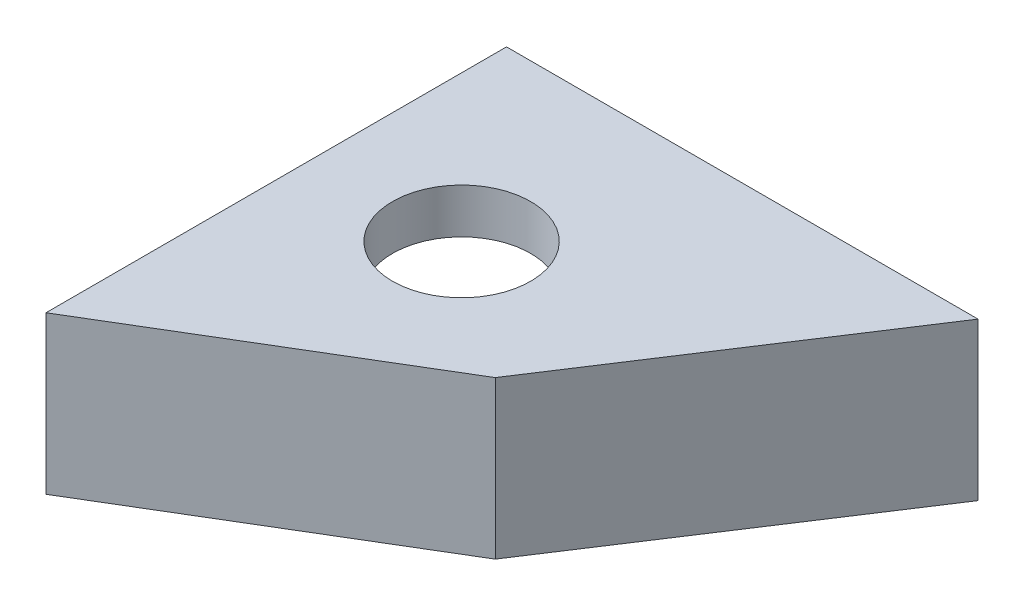
ISO-10303-21;
HEADER;
FILE_DESCRIPTION(('STEP AP214'),'2;1');
FILE_NAME('part.step','',(''),(''),'','','');
FILE_SCHEMA(('AUTOMOTIVE_DESIGN { 1 0 10303 214 1 1 1 1 }'));
ENDSEC;
DATA;
#1=APPLICATION_CONTEXT('core data for automotive mechanical design processes');
#2=APPLICATION_PROTOCOL_DEFINITION('international standard','automotive_design',2000,#1);
#3=PRODUCT_CONTEXT('',#1,'mechanical');
#4=PRODUCT('Part','Part','',(#3));
#5=PRODUCT_RELATED_PRODUCT_CATEGORY('part','',(#4));
#6=PRODUCT_DEFINITION_FORMATION('','',#4);
#7=PRODUCT_DEFINITION_CONTEXT('part definition',#1,'design');
#8=PRODUCT_DEFINITION('design','',#6,#7);
#9=PRODUCT_DEFINITION_SHAPE('','',#8);
#10=(LENGTH_UNIT() NAMED_UNIT(*) SI_UNIT(.MILLI.,.METRE.));
#11=(NAMED_UNIT(*) PLANE_ANGLE_UNIT() SI_UNIT($,.RADIAN.));
#12=(NAMED_UNIT(*) SI_UNIT($,.STERADIAN.) SOLID_ANGLE_UNIT());
#13=UNCERTAINTY_MEASURE_WITH_UNIT(LENGTH_MEASURE(1.E-05),#10,'distance_accuracy_value','');
#14=(GEOMETRIC_REPRESENTATION_CONTEXT(3) GLOBAL_UNCERTAINTY_ASSIGNED_CONTEXT((#13)) GLOBAL_UNIT_ASSIGNED_CONTEXT((#10,
#11,#12)) REPRESENTATION_CONTEXT('',''));
#15=CARTESIAN_POINT('',(0.,0.,0.));
#16=DIRECTION('',(0.,0.,1.));
#17=DIRECTION('',(1.,0.,0.));
#18=AXIS2_PLACEMENT_3D('',#15,#16,#17);
#19=CARTESIAN_POINT('',(0.,0.,0.));
#20=DIRECTION('',(0.,1.,0.));
#21=DIRECTION('',(0.,0.,1.));
#22=AXIS2_PLACEMENT_3D('',#19,#20,#21);
#23=PLANE('',#22);
#24=CARTESIAN_POINT('',(76.3822956151013,0.,129.15690287011));
#25=DIRECTION('',(0.,1.,0.));
#26=DIRECTION('',(0.,0.,1.));
#27=AXIS2_PLACEMENT_3D('',#24,#25,#26);
#28=CIRCLE('',#27,3.07499999999999);
#29=CARTESIAN_POINT('',(76.3822956151013,0.,132.23190287011));
#30=VERTEX_POINT('',#29);
#31=EDGE_CURVE('E125',#30,#30,#28,.T.);
#32=ORIENTED_EDGE('',*,*,#31,.T.);
#33=EDGE_LOOP('',(#32));
#34=FACE_BOUND('',#33,.T.);
#35=DIRECTION('',(0.687083957502849,0.,-0.726578031144779));
#36=VECTOR('',#35,1.);
#37=CARTESIAN_POINT('',(90.8714601720809,0.,120.65690287011));
#38=LINE('',#37,#36);
#39=CARTESIAN_POINT('',(80.3000063196038,0.,131.836011394761));
#40=VERTEX_POINT('',#39);
#41=CARTESIAN_POINT('',(90.8714601720809,0.,120.65690287011));
#42=VERTEX_POINT('',#41);
#43=EDGE_CURVE('E48',#40,#42,#38,.T.);
#44=ORIENTED_EDGE('',*,*,#43,.F.);
#45=DIRECTION('',(0.764931472959137,0.,-0.644111668638726));
#46=VECTOR('',#45,1.);
#47=CARTESIAN_POINT('',(80.3000063196038,0.,131.836011394761));
#48=LINE('',#47,#46);
#49=CARTESIAN_POINT('',(74.8425740517613,0.,136.43145023966));
#50=VERTEX_POINT('',#49);
#51=EDGE_CURVE('E52',#50,#40,#48,.T.);
#52=ORIENTED_EDGE('',*,*,#51,.F.);
#53=DIRECTION('',(0.857492925712545,0.,-0.514495755427526));
#54=VECTOR('',#53,1.);
#55=CARTESIAN_POINT('',(71.8822956151013,0.,138.207617301656));
#56=LINE('',#55,#54);
#57=CARTESIAN_POINT('',(71.8822956151013,0.,138.207617301656));
#58=VERTEX_POINT('',#57);
#59=EDGE_CURVE('E190',#58,#50,#56,.T.);
#60=ORIENTED_EDGE('',*,*,#59,.F.);
#61=DIRECTION('',(0.848134440962652,0.,-0.529781058601542));
#62=VECTOR('',#61,1.);
#63=CARTESIAN_POINT('',(71.8822956151013,0.,138.207617301656));
#64=LINE('',#63,#62);
#65=CARTESIAN_POINT('',(69.8822956151013,0.,139.45690287011));
#66=VERTEX_POINT('',#65);
#67=EDGE_CURVE('E191',#66,#58,#64,.T.);
#68=ORIENTED_EDGE('',*,*,#67,.F.);
#69=DIRECTION('',(0.,0.,1.));
#70=VECTOR('',#69,1.);
#71=CARTESIAN_POINT('',(69.8822956151013,0.,141.15690287011));
#72=LINE('',#71,#70);
#73=CARTESIAN_POINT('',(69.8822956151013,0.,120.65690287011));
#74=VERTEX_POINT('',#73);
#75=EDGE_CURVE('E124',#74,#66,#72,.T.);
#76=ORIENTED_EDGE('',*,*,#75,.F.);
#77=DIRECTION('',(-1.,0.,0.));
#78=VECTOR('',#77,1.);
#79=CARTESIAN_POINT('',(69.8822956151013,0.,120.65690287011));
#80=LINE('',#79,#78);
#81=EDGE_CURVE('E135',#42,#74,#80,.T.);
#82=ORIENTED_EDGE('',*,*,#81,.F.);
#83=EDGE_LOOP('',(#44,#52,#60,#68,#76,#82));
#84=FACE_BOUND('',#83,.T.);
#85=ADVANCED_FACE('F33',(#34,#84),#23,.F.);
#86=CARTESIAN_POINT('',(0.,2.,0.));
#87=DIRECTION('',(0.,1.,0.));
#88=DIRECTION('',(0.,0.,1.));
#89=AXIS2_PLACEMENT_3D('',#86,#87,#88);
#90=PLANE('',#89);
#91=DIRECTION('',(-1.,0.,0.));
#92=VECTOR('',#91,1.);
#93=CARTESIAN_POINT('',(69.8822956151013,2.,120.65690287011));
#94=LINE('',#93,#92);
#95=CARTESIAN_POINT('',(90.8714601720809,2.,120.65690287011));
#96=VERTEX_POINT('',#95);
#97=CARTESIAN_POINT('',(69.8822956151013,2.,120.65690287011));
#98=VERTEX_POINT('',#97);
#99=EDGE_CURVE('E137',#96,#98,#94,.T.);
#100=ORIENTED_EDGE('',*,*,#99,.T.);
#101=DIRECTION('',(0.,0.,1.));
#102=VECTOR('',#101,1.);
#103=CARTESIAN_POINT('',(69.8822956151013,2.,141.15690287011));
#104=LINE('',#103,#102);
#105=CARTESIAN_POINT('',(69.8822956151013,2.,141.15690287011));
#106=VERTEX_POINT('',#105);
#107=EDGE_CURVE('E140',#98,#106,#104,.T.);
#108=ORIENTED_EDGE('',*,*,#107,.T.);
#109=DIRECTION('',(0.857492925712545,0.,-0.514495755427525));
#110=VECTOR('',#109,1.);
#111=CARTESIAN_POINT('',(69.8822956151013,2.,141.15690287011));
#112=LINE('',#111,#110);
#113=CARTESIAN_POINT('',(82.3822956151013,2.,133.65690287011));
#114=VERTEX_POINT('',#113);
#115=EDGE_CURVE('E142',#106,#114,#112,.T.);
#116=ORIENTED_EDGE('',*,*,#115,.T.);
#117=DIRECTION('',(0.546760394266227,0.,-0.837289120472636));
#118=VECTOR('',#117,1.);
#119=CARTESIAN_POINT('',(90.8714601720809,2.,120.65690287011));
#120=LINE('',#119,#118);
#121=EDGE_CURVE('E144',#114,#96,#120,.T.);
#122=ORIENTED_EDGE('',*,*,#121,.T.);
#123=EDGE_LOOP('',(#100,#108,#116,#122));
#124=FACE_BOUND('',#123,.T.);
#125=CARTESIAN_POINT('',(76.3822956151013,2.,129.15690287011));
#126=DIRECTION('',(0.,1.,0.));
#127=DIRECTION('',(0.,0.,1.));
#128=AXIS2_PLACEMENT_3D('',#125,#126,#127);
#129=CIRCLE('',#128,3.07499999999999);
#130=CARTESIAN_POINT('',(76.3822956151013,2.,132.23190287011));
#131=VERTEX_POINT('',#130);
#132=EDGE_CURVE('E128',#131,#131,#129,.T.);
#133=ORIENTED_EDGE('',*,*,#132,.F.);
#134=EDGE_LOOP('',(#133));
#135=FACE_BOUND('',#134,.T.);
#136=ADVANCED_FACE('F159',(#124,#135),#90,.T.);
#137=CARTESIAN_POINT('',(69.8822956151013,2.,120.65690287011));
#138=DIRECTION('',(0.,0.,1.));
#139=DIRECTION('',(1.,0.,0.));
#140=AXIS2_PLACEMENT_3D('',#137,#138,#139);
#141=PLANE('',#140);
#142=ORIENTED_EDGE('',*,*,#81,.T.);
#143=DIRECTION('',(0.,-1.,0.));
#144=VECTOR('',#143,1.);
#145=CARTESIAN_POINT('',(69.8822956151013,2.,120.65690287011));
#146=LINE('',#145,#144);
#147=EDGE_CURVE('E11',#98,#74,#146,.T.);
#148=ORIENTED_EDGE('',*,*,#147,.F.);
#149=ORIENTED_EDGE('',*,*,#99,.F.);
#150=DIRECTION('',(0.,-1.,0.));
#151=VECTOR('',#150,1.);
#152=CARTESIAN_POINT('',(90.8714601720809,2.,120.65690287011));
#153=LINE('',#152,#151);
#154=EDGE_CURVE('E146',#96,#42,#153,.T.);
#155=ORIENTED_EDGE('',*,*,#154,.T.);
#156=EDGE_LOOP('',(#142,#148,#149,#155));
#157=FACE_BOUND('',#156,.T.);
#158=ADVANCED_FACE('F35',(#157),#141,.F.);
#159=CARTESIAN_POINT('',(69.8822956151013,2.,141.15690287011));
#160=DIRECTION('',(1.,0.,0.));
#161=DIRECTION('',(0.,0.,-1.));
#162=AXIS2_PLACEMENT_3D('',#159,#160,#161);
#163=PLANE('',#162);
#164=ORIENTED_EDGE('',*,*,#75,.T.);
#165=DIRECTION('',(0.,1.,0.));
#166=VECTOR('',#165,1.);
#167=CARTESIAN_POINT('',(69.8822956151013,-5.,139.45690287011));
#168=LINE('',#167,#166);
#169=CARTESIAN_POINT('',(69.8822956151013,-5.,139.45690287011));
#170=VERTEX_POINT('',#169);
#171=EDGE_CURVE('E105',#170,#66,#168,.T.);
#172=ORIENTED_EDGE('',*,*,#171,.F.);
#173=DIRECTION('',(0.,0.,-1.));
#174=VECTOR('',#173,1.);
#175=CARTESIAN_POINT('',(69.8822956151013,-5.,139.45690287011));
#176=LINE('',#175,#174);
#177=CARTESIAN_POINT('',(69.8822956151013,-5.,141.15690287011));
#178=VERTEX_POINT('',#177);
#179=EDGE_CURVE('E111',#178,#170,#176,.T.);
#180=ORIENTED_EDGE('',*,*,#179,.F.);
#181=DIRECTION('',(0.,-1.,0.));
#182=VECTOR('',#181,1.);
#183=CARTESIAN_POINT('',(69.8822956151013,2.,141.15690287011));
#184=LINE('',#183,#182);
#185=EDGE_CURVE('E41',#106,#178,#184,.T.);
#186=ORIENTED_EDGE('',*,*,#185,.F.);
#187=ORIENTED_EDGE('',*,*,#107,.F.);
#188=ORIENTED_EDGE('',*,*,#147,.T.);
#189=EDGE_LOOP('',(#164,#172,#180,#186,#187,#188));
#190=FACE_BOUND('',#189,.T.);
#191=ADVANCED_FACE('F123',(#190),#163,.F.);
#192=CARTESIAN_POINT('',(69.8822956151013,2.,141.15690287011));
#193=DIRECTION('',(-0.514495755427525,0.,-0.857492925712545));
#194=DIRECTION('',(-0.857492925712545,0.,0.514495755427525));
#195=AXIS2_PLACEMENT_3D('',#192,#193,#194);
#196=PLANE('',#195);
#197=ORIENTED_EDGE('',*,*,#185,.T.);
#198=DIRECTION('',(-0.857492925712545,0.,0.514495755427525));
#199=VECTOR('',#198,1.);
#200=CARTESIAN_POINT('',(69.8822956151013,-5.,141.15690287011));
#201=LINE('',#200,#199);
#202=CARTESIAN_POINT('',(82.3822956151013,-5.,133.65690287011));
#203=VERTEX_POINT('',#202);
#204=EDGE_CURVE('E118',#203,#178,#201,.T.);
#205=ORIENTED_EDGE('',*,*,#204,.F.);
#206=DIRECTION('',(0.,-1.,0.));
#207=VECTOR('',#206,1.);
#208=CARTESIAN_POINT('',(82.3822956151013,2.,133.65690287011));
#209=LINE('',#208,#207);
#210=EDGE_CURVE('E151',#114,#203,#209,.T.);
#211=ORIENTED_EDGE('',*,*,#210,.F.);
#212=ORIENTED_EDGE('',*,*,#115,.F.);
#213=EDGE_LOOP('',(#197,#205,#211,#212));
#214=FACE_BOUND('',#213,.T.);
#215=ADVANCED_FACE('F154',(#214),#196,.F.);
#216=CARTESIAN_POINT('',(90.8714601720809,2.,120.65690287011));
#217=DIRECTION('',(-0.837289120472636,0.,-0.546760394266227));
#218=DIRECTION('',(-0.546760394266227,0.,0.837289120472636));
#219=AXIS2_PLACEMENT_3D('',#216,#217,#218);
#220=PLANE('',#219);
#221=ORIENTED_EDGE('',*,*,#210,.T.);
#222=DIRECTION('',(-0.546760394266227,0.,0.837289120472636));
#223=VECTOR('',#222,1.);
#224=CARTESIAN_POINT('',(82.3822956151013,-5.,133.65690287011));
#225=LINE('',#224,#223);
#226=CARTESIAN_POINT('',(90.8714601720809,-5.,120.65690287011));
#227=VERTEX_POINT('',#226);
#228=EDGE_CURVE('E177',#227,#203,#225,.T.);
#229=ORIENTED_EDGE('',*,*,#228,.F.);
#230=DIRECTION('',(0.,1.,0.));
#231=VECTOR('',#230,1.);
#232=CARTESIAN_POINT('',(90.8714601720809,-5.,120.65690287011));
#233=LINE('',#232,#231);
#234=EDGE_CURVE('E170',#227,#42,#233,.T.);
#235=ORIENTED_EDGE('',*,*,#234,.T.);
#236=ORIENTED_EDGE('',*,*,#154,.F.);
#237=ORIENTED_EDGE('',*,*,#121,.F.);
#238=EDGE_LOOP('',(#221,#229,#235,#236,#237));
#239=FACE_BOUND('',#238,.T.);
#240=ADVANCED_FACE('F176',(#239),#220,.F.);
#241=CARTESIAN_POINT('',(76.3822956151013,2.,129.15690287011));
#242=DIRECTION('',(0.,-1.,0.));
#243=DIRECTION('',(0.,0.,-1.));
#244=AXIS2_PLACEMENT_3D('',#241,#242,#243);
#245=CYLINDRICAL_SURFACE('',#244,3.07499999999999);
#246=ORIENTED_EDGE('',*,*,#132,.T.);
#247=EDGE_LOOP('',(#246));
#248=FACE_BOUND('',#247,.T.);
#249=ORIENTED_EDGE('',*,*,#31,.F.);
#250=EDGE_LOOP('',(#249));
#251=FACE_BOUND('',#250,.T.);
#252=ADVANCED_FACE('F206',(#248,#251),#245,.F.);
#253=CARTESIAN_POINT('',(71.8822956151013,-5.,138.207617301656));
#254=DIRECTION('',(0.529781058601542,0.,0.848134440962652));
#255=DIRECTION('',(0.848134440962652,0.,-0.529781058601542));
#256=AXIS2_PLACEMENT_3D('',#253,#254,#255);
#257=PLANE('',#256);
#258=ORIENTED_EDGE('',*,*,#67,.T.);
#259=DIRECTION('',(0.,1.,0.));
#260=VECTOR('',#259,1.);
#261=CARTESIAN_POINT('',(71.8822956151013,-5.,138.207617301656));
#262=LINE('',#261,#260);
#263=CARTESIAN_POINT('',(71.8822956151013,-5.,138.207617301656));
#264=VERTEX_POINT('',#263);
#265=EDGE_CURVE('E107',#264,#58,#262,.T.);
#266=ORIENTED_EDGE('',*,*,#265,.F.);
#267=DIRECTION('',(0.848134440962652,0.,-0.529781058601542));
#268=VECTOR('',#267,1.);
#269=CARTESIAN_POINT('',(71.8822956151013,-5.,138.207617301656));
#270=LINE('',#269,#268);
#271=EDGE_CURVE('E100',#170,#264,#270,.T.);
#272=ORIENTED_EDGE('',*,*,#271,.F.);
#273=ORIENTED_EDGE('',*,*,#171,.T.);
#274=EDGE_LOOP('',(#258,#266,#272,#273));
#275=FACE_BOUND('',#274,.T.);
#276=ADVANCED_FACE('F103',(#275),#257,.F.);
#277=CARTESIAN_POINT('',(71.8822956151013,-5.,138.207617301656));
#278=DIRECTION('',(0.514495755427526,0.,0.857492925712545));
#279=DIRECTION('',(0.857492925712545,0.,-0.514495755427526));
#280=AXIS2_PLACEMENT_3D('',#277,#278,#279);
#281=PLANE('',#280);
#282=ORIENTED_EDGE('',*,*,#59,.T.);
#283=DIRECTION('',(0.,1.,0.));
#284=VECTOR('',#283,1.);
#285=CARTESIAN_POINT('',(74.8425740517613,-5.,136.43145023966));
#286=LINE('',#285,#284);
#287=CARTESIAN_POINT('',(74.8425740517613,-5.,136.43145023966));
#288=VERTEX_POINT('',#287);
#289=EDGE_CURVE('E130',#288,#50,#286,.T.);
#290=ORIENTED_EDGE('',*,*,#289,.F.);
#291=DIRECTION('',(0.857492925712545,0.,-0.514495755427526));
#292=VECTOR('',#291,1.);
#293=CARTESIAN_POINT('',(71.8822956151013,-5.,138.207617301656));
#294=LINE('',#293,#292);
#295=EDGE_CURVE('E110',#264,#288,#294,.T.);
#296=ORIENTED_EDGE('',*,*,#295,.F.);
#297=ORIENTED_EDGE('',*,*,#265,.T.);
#298=EDGE_LOOP('',(#282,#290,#296,#297));
#299=FACE_BOUND('',#298,.T.);
#300=ADVANCED_FACE('F189',(#299),#281,.F.);
#301=CARTESIAN_POINT('',(80.3000063196038,-5.,131.836011394761));
#302=DIRECTION('',(0.644111668638726,0.,0.764931472959137));
#303=DIRECTION('',(0.764931472959137,0.,-0.644111668638726));
#304=AXIS2_PLACEMENT_3D('',#301,#302,#303);
#305=PLANE('',#304);
#306=ORIENTED_EDGE('',*,*,#51,.T.);
#307=DIRECTION('',(0.,1.,0.));
#308=VECTOR('',#307,1.);
#309=CARTESIAN_POINT('',(80.3000063196038,-5.,131.836011394761));
#310=LINE('',#309,#308);
#311=CARTESIAN_POINT('',(80.3000063196038,-5.,131.836011394761));
#312=VERTEX_POINT('',#311);
#313=EDGE_CURVE('E173',#312,#40,#310,.T.);
#314=ORIENTED_EDGE('',*,*,#313,.F.);
#315=DIRECTION('',(0.764931472959137,0.,-0.644111668638726));
#316=VECTOR('',#315,1.);
#317=CARTESIAN_POINT('',(80.3000063196038,-5.,131.836011394761));
#318=LINE('',#317,#316);
#319=EDGE_CURVE('E187',#288,#312,#318,.T.);
#320=ORIENTED_EDGE('',*,*,#319,.F.);
#321=ORIENTED_EDGE('',*,*,#289,.T.);
#322=EDGE_LOOP('',(#306,#314,#320,#321));
#323=FACE_BOUND('',#322,.T.);
#324=ADVANCED_FACE('F186',(#323),#305,.F.);
#325=CARTESIAN_POINT('',(90.8714601720809,-5.,120.65690287011));
#326=DIRECTION('',(0.726578031144779,0.,0.687083957502849));
#327=DIRECTION('',(0.687083957502849,0.,-0.726578031144779));
#328=AXIS2_PLACEMENT_3D('',#325,#326,#327);
#329=PLANE('',#328);
#330=ORIENTED_EDGE('',*,*,#43,.T.);
#331=ORIENTED_EDGE('',*,*,#234,.F.);
#332=DIRECTION('',(0.687083957502849,0.,-0.726578031144779));
#333=VECTOR('',#332,1.);
#334=CARTESIAN_POINT('',(90.8714601720809,-5.,120.65690287011));
#335=LINE('',#334,#333);
#336=EDGE_CURVE('E196',#312,#227,#335,.T.);
#337=ORIENTED_EDGE('',*,*,#336,.F.);
#338=ORIENTED_EDGE('',*,*,#313,.T.);
#339=EDGE_LOOP('',(#330,#331,#337,#338));
#340=FACE_BOUND('',#339,.T.);
#341=ADVANCED_FACE('F168',(#340),#329,.F.);
#342=CARTESIAN_POINT('',(0.,-5.,0.));
#343=DIRECTION('',(0.,1.,0.));
#344=DIRECTION('',(0.,0.,1.));
#345=AXIS2_PLACEMENT_3D('',#342,#343,#344);
#346=PLANE('',#345);
#347=ORIENTED_EDGE('',*,*,#179,.T.);
#348=ORIENTED_EDGE('',*,*,#271,.T.);
#349=ORIENTED_EDGE('',*,*,#295,.T.);
#350=ORIENTED_EDGE('',*,*,#319,.T.);
#351=ORIENTED_EDGE('',*,*,#336,.T.);
#352=ORIENTED_EDGE('',*,*,#228,.T.);
#353=ORIENTED_EDGE('',*,*,#204,.T.);
#354=EDGE_LOOP('',(#347,#348,#349,#350,#351,#352,#353));
#355=FACE_BOUND('',#354,.T.);
#356=ADVANCED_FACE('F115',(#355),#346,.F.);
#357=CLOSED_SHELL('',(#85,#136,#158,#191,#215,#240,#252,#276,#300,#324,#341,#356));
#358=MANIFOLD_SOLID_BREP('B2',#357);
#359=ADVANCED_BREP_SHAPE_REPRESENTATION('',(#18,#358),#14);
#360=SHAPE_DEFINITION_REPRESENTATION(#9,#359);
ENDSEC;
END-ISO-10303-21;
